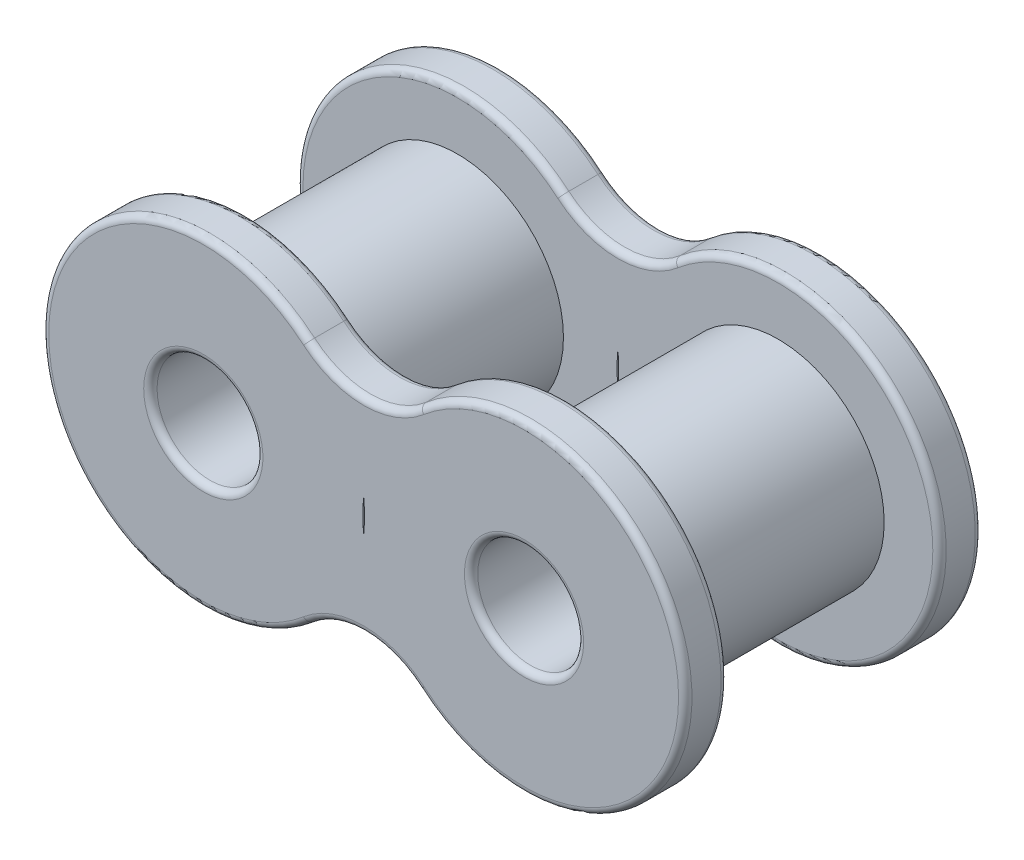
ISO-10303-21;
HEADER;
FILE_DESCRIPTION(('STEP AP214'),'2;1');
FILE_NAME('part.step','',(''),(''),'','','');
FILE_SCHEMA(('AUTOMOTIVE_DESIGN { 1 0 10303 214 1 1 1 1 }'));
ENDSEC;
DATA;
#1=APPLICATION_CONTEXT('core data for automotive mechanical design processes');
#2=APPLICATION_PROTOCOL_DEFINITION('international standard','automotive_design',2000,#1);
#3=PRODUCT_CONTEXT('',#1,'mechanical');
#4=PRODUCT('Part','Part','',(#3));
#5=PRODUCT_RELATED_PRODUCT_CATEGORY('part','',(#4));
#6=PRODUCT_DEFINITION_FORMATION('','',#4);
#7=PRODUCT_DEFINITION_CONTEXT('part definition',#1,'design');
#8=PRODUCT_DEFINITION('design','',#6,#7);
#9=PRODUCT_DEFINITION_SHAPE('','',#8);
#10=(LENGTH_UNIT() NAMED_UNIT(*) SI_UNIT(.MILLI.,.METRE.));
#11=(NAMED_UNIT(*) PLANE_ANGLE_UNIT() SI_UNIT($,.RADIAN.));
#12=(NAMED_UNIT(*) SI_UNIT($,.STERADIAN.) SOLID_ANGLE_UNIT());
#13=UNCERTAINTY_MEASURE_WITH_UNIT(LENGTH_MEASURE(1.E-05),#10,'distance_accuracy_value','');
#14=(GEOMETRIC_REPRESENTATION_CONTEXT(3) GLOBAL_UNCERTAINTY_ASSIGNED_CONTEXT((#13)) GLOBAL_UNIT_ASSIGNED_CONTEXT((#10,
#11,#12)) REPRESENTATION_CONTEXT('',''));
#15=CARTESIAN_POINT('',(0.,0.,0.));
#16=DIRECTION('',(0.,0.,1.));
#17=DIRECTION('',(1.,0.,0.));
#18=AXIS2_PLACEMENT_3D('',#15,#16,#17);
#19=CARTESIAN_POINT('',(3.,3.51510335018759,1.5875));
#20=DIRECTION('',(0.,0.,1.));
#21=DIRECTION('',(1.,0.,0.));
#22=AXIS2_PLACEMENT_3D('',#19,#20,#21);
#23=PLANE('',#22);
#24=CARTESIAN_POINT('',(-6.,0.,1.5875));
#25=DIRECTION('',(0.,0.,1.));
#26=DIRECTION('',(1.,0.,0.));
#27=AXIS2_PLACEMENT_3D('',#24,#25,#26);
#28=CIRCLE('',#27,3.9624);
#29=CARTESIAN_POINT('',(-2.0376,0.,1.5875));
#30=VERTEX_POINT('',#29);
#31=EDGE_CURVE('E288',#30,#30,#28,.T.);
#32=ORIENTED_EDGE('',*,*,#31,.F.);
#33=EDGE_LOOP('',(#32));
#34=FACE_BOUND('',#33,.T.);
#35=CARTESIAN_POINT('',(6.,0.,1.5875));
#36=DIRECTION('',(0.,0.,1.));
#37=DIRECTION('',(1.,0.,0.));
#38=AXIS2_PLACEMENT_3D('',#35,#36,#37);
#39=CIRCLE('',#38,3.9624);
#40=CARTESIAN_POINT('',(9.9624,0.,1.5875));
#41=VERTEX_POINT('',#40);
#42=EDGE_CURVE('E215',#41,#41,#39,.T.);
#43=ORIENTED_EDGE('',*,*,#42,.F.);
#44=EDGE_LOOP('',(#43));
#45=FACE_BOUND('',#44,.T.);
#46=CARTESIAN_POINT('',(6.,0.,1.5875));
#47=DIRECTION('',(0.,0.,1.));
#48=DIRECTION('',(1.,0.,0.));
#49=AXIS2_PLACEMENT_3D('',#46,#47,#48);
#50=CIRCLE('',#49,5.7825);
#51=CARTESIAN_POINT('',(2.24614552339735,-4.39839548227421,1.5875));
#52=VERTEX_POINT('',#51);
#53=CARTESIAN_POINT('',(2.24614552339735,4.39839548227421,1.5875));
#54=VERTEX_POINT('',#53);
#55=EDGE_CURVE('E279',#52,#54,#50,.T.);
#56=ORIENTED_EDGE('',*,*,#55,.T.);
#57=CARTESIAN_POINT('',(0.,7.03020670037517,1.5875));
#58=DIRECTION('',(0.,0.,1.));
#59=DIRECTION('',(1.,0.,0.));
#60=AXIS2_PLACEMENT_3D('',#57,#58,#59);
#61=CIRCLE('',#60,3.46);
#62=CARTESIAN_POINT('',(-2.24614552339735,4.39839548227421,1.5875));
#63=VERTEX_POINT('',#62);
#64=EDGE_CURVE('E281',#54,#63,#61,.F.);
#65=ORIENTED_EDGE('',*,*,#64,.T.);
#66=CARTESIAN_POINT('',(-6.,0.,1.5875));
#67=DIRECTION('',(0.,0.,1.));
#68=DIRECTION('',(1.,0.,0.));
#69=AXIS2_PLACEMENT_3D('',#66,#67,#68);
#70=CIRCLE('',#69,5.7825);
#71=CARTESIAN_POINT('',(-2.24614552339735,-4.39839548227422,1.5875));
#72=VERTEX_POINT('',#71);
#73=EDGE_CURVE('E275',#63,#72,#70,.T.);
#74=ORIENTED_EDGE('',*,*,#73,.T.);
#75=CARTESIAN_POINT('',(0.,-7.03020670037517,1.5875));
#76=DIRECTION('',(0.,0.,1.));
#77=DIRECTION('',(1.,0.,0.));
#78=AXIS2_PLACEMENT_3D('',#75,#76,#77);
#79=CIRCLE('',#78,3.46);
#80=EDGE_CURVE('E277',#72,#52,#79,.F.);
#81=ORIENTED_EDGE('',*,*,#80,.T.);
#82=EDGE_LOOP('',(#56,#65,#74,#81));
#83=FACE_BOUND('',#82,.T.);
#84=CARTESIAN_POINT('',(-6.,0.,1.5875));
#85=DIRECTION('',(0.,0.,1.));
#86=DIRECTION('',(1.,0.,0.));
#87=AXIS2_PLACEMENT_3D('',#84,#85,#86);
#88=CIRCLE('',#87,6.0325);
#89=CARTESIAN_POINT('',(0.,-0.625344904832522,1.5875));
#90=VERTEX_POINT('',#89);
#91=CARTESIAN_POINT('',(0.,0.625344904832519,1.5875));
#92=VERTEX_POINT('',#91);
#93=EDGE_CURVE('E225',#90,#92,#88,.T.);
#94=ORIENTED_EDGE('',*,*,#93,.F.);
#95=CARTESIAN_POINT('',(6.,0.,1.5875));
#96=DIRECTION('',(0.,0.,1.));
#97=DIRECTION('',(-1.,0.,0.));
#98=AXIS2_PLACEMENT_3D('',#95,#96,#97);
#99=CIRCLE('',#98,6.0325);
#100=EDGE_CURVE('E222',#92,#90,#99,.T.);
#101=ORIENTED_EDGE('',*,*,#100,.F.);
#102=EDGE_LOOP('',(#94,#101));
#103=FACE_BOUND('',#102,.T.);
#104=ADVANCED_FACE('F35',(#34,#45,#83,#103),#23,.T.);
#105=CARTESIAN_POINT('',(3.,3.51510335018759,0.));
#106=DIRECTION('',(0.,0.,1.));
#107=DIRECTION('',(1.,0.,0.));
#108=AXIS2_PLACEMENT_3D('',#105,#106,#107);
#109=PLANE('',#108);
#110=CARTESIAN_POINT('',(-6.,0.,0.));
#111=DIRECTION('',(0.,0.,1.));
#112=DIRECTION('',(1.,0.,0.));
#113=AXIS2_PLACEMENT_3D('',#110,#111,#112);
#114=CIRCLE('',#113,2.23);
#115=CARTESIAN_POINT('',(-3.77,0.,0.));
#116=VERTEX_POINT('',#115);
#117=EDGE_CURVE('E376',#116,#116,#114,.T.);
#118=ORIENTED_EDGE('',*,*,#117,.T.);
#119=EDGE_LOOP('',(#118));
#120=FACE_BOUND('',#119,.T.);
#121=CARTESIAN_POINT('',(6.,0.,0.));
#122=DIRECTION('',(0.,0.,1.));
#123=DIRECTION('',(1.,0.,0.));
#124=AXIS2_PLACEMENT_3D('',#121,#122,#123);
#125=CIRCLE('',#124,2.23);
#126=CARTESIAN_POINT('',(8.23,0.,0.));
#127=VERTEX_POINT('',#126);
#128=EDGE_CURVE('E373',#127,#127,#125,.T.);
#129=ORIENTED_EDGE('',*,*,#128,.T.);
#130=EDGE_LOOP('',(#129));
#131=FACE_BOUND('',#130,.T.);
#132=CARTESIAN_POINT('',(-6.,0.,0.));
#133=DIRECTION('',(0.,0.,1.));
#134=DIRECTION('',(1.,0.,0.));
#135=AXIS2_PLACEMENT_3D('',#132,#133,#134);
#136=CIRCLE('',#135,5.7825);
#137=CARTESIAN_POINT('',(-2.24614552339735,-4.39839548227422,0.));
#138=VERTEX_POINT('',#137);
#139=CARTESIAN_POINT('',(-2.24614552339735,4.39839548227421,0.));
#140=VERTEX_POINT('',#139);
#141=EDGE_CURVE('E258',#138,#140,#136,.F.);
#142=ORIENTED_EDGE('',*,*,#141,.T.);
#143=CARTESIAN_POINT('',(0.,7.03020670037517,0.));
#144=DIRECTION('',(0.,0.,1.));
#145=DIRECTION('',(1.,0.,0.));
#146=AXIS2_PLACEMENT_3D('',#143,#144,#145);
#147=CIRCLE('',#146,3.46);
#148=CARTESIAN_POINT('',(2.24614552339735,4.39839548227421,0.));
#149=VERTEX_POINT('',#148);
#150=EDGE_CURVE('E264',#140,#149,#147,.T.);
#151=ORIENTED_EDGE('',*,*,#150,.T.);
#152=CARTESIAN_POINT('',(6.,0.,0.));
#153=DIRECTION('',(0.,0.,1.));
#154=DIRECTION('',(1.,0.,0.));
#155=AXIS2_PLACEMENT_3D('',#152,#153,#154);
#156=CIRCLE('',#155,5.7825);
#157=CARTESIAN_POINT('',(2.24614552339735,-4.39839548227421,0.));
#158=VERTEX_POINT('',#157);
#159=EDGE_CURVE('E262',#149,#158,#156,.F.);
#160=ORIENTED_EDGE('',*,*,#159,.T.);
#161=CARTESIAN_POINT('',(0.,-7.03020670037517,0.));
#162=DIRECTION('',(0.,0.,1.));
#163=DIRECTION('',(1.,0.,0.));
#164=AXIS2_PLACEMENT_3D('',#161,#162,#163);
#165=CIRCLE('',#164,3.46);
#166=EDGE_CURVE('E260',#158,#138,#165,.T.);
#167=ORIENTED_EDGE('',*,*,#166,.T.);
#168=EDGE_LOOP('',(#142,#151,#160,#167));
#169=FACE_BOUND('',#168,.T.);
#170=CARTESIAN_POINT('',(6.,0.,0.));
#171=DIRECTION('',(0.,0.,1.));
#172=DIRECTION('',(-1.,0.,0.));
#173=AXIS2_PLACEMENT_3D('',#170,#171,#172);
#174=CIRCLE('',#173,6.0325);
#175=CARTESIAN_POINT('',(0.,0.625344904832519,0.));
#176=VERTEX_POINT('',#175);
#177=CARTESIAN_POINT('',(0.,-0.625344904832522,0.));
#178=VERTEX_POINT('',#177);
#179=EDGE_CURVE('E229',#176,#178,#174,.T.);
#180=ORIENTED_EDGE('',*,*,#179,.T.);
#181=CARTESIAN_POINT('',(-6.,0.,0.));
#182=DIRECTION('',(0.,0.,1.));
#183=DIRECTION('',(1.,0.,0.));
#184=AXIS2_PLACEMENT_3D('',#181,#182,#183);
#185=CIRCLE('',#184,6.0325);
#186=EDGE_CURVE('E226',#178,#176,#185,.T.);
#187=ORIENTED_EDGE('',*,*,#186,.T.);
#188=EDGE_LOOP('',(#180,#187));
#189=FACE_BOUND('',#188,.T.);
#190=ADVANCED_FACE('F390',(#120,#131,#169,#189),#109,.F.);
#191=CARTESIAN_POINT('',(0.,7.03020670037517,1.5875));
#192=DIRECTION('',(0.,0.,-1.));
#193=DIRECTION('',(-1.,0.,0.));
#194=AXIS2_PLACEMENT_3D('',#191,#192,#193);
#195=CYLINDRICAL_SURFACE('',#194,3.21);
#196=DIRECTION('',(0.,0.,-1.));
#197=VECTOR('',#196,1.);
#198=CARTESIAN_POINT('',(2.08385177170679,4.58855525236821,1.5875));
#199=LINE('',#198,#197);
#200=CARTESIAN_POINT('',(2.08385177170679,4.58855525236821,1.3375));
#201=VERTEX_POINT('',#200);
#202=CARTESIAN_POINT('',(2.08385177170679,4.58855525236821,0.25));
#203=VERTEX_POINT('',#202);
#204=EDGE_CURVE('E240',#201,#203,#199,.T.);
#205=ORIENTED_EDGE('',*,*,#204,.T.);
#206=CARTESIAN_POINT('',(0.,7.03020670037517,0.25));
#207=DIRECTION('',(0.,0.,1.));
#208=DIRECTION('',(1.,0.,0.));
#209=AXIS2_PLACEMENT_3D('',#206,#207,#208);
#210=CIRCLE('',#209,3.21);
#211=CARTESIAN_POINT('',(-2.08385177170679,4.58855525236821,0.25));
#212=VERTEX_POINT('',#211);
#213=EDGE_CURVE('E255',#203,#212,#210,.F.);
#214=ORIENTED_EDGE('',*,*,#213,.T.);
#215=DIRECTION('',(0.,0.,-1.));
#216=VECTOR('',#215,1.);
#217=CARTESIAN_POINT('',(-2.08385177170679,4.58855525236821,1.5875));
#218=LINE('',#217,#216);
#219=CARTESIAN_POINT('',(-2.08385177170679,4.58855525236821,1.3375));
#220=VERTEX_POINT('',#219);
#221=EDGE_CURVE('E249',#220,#212,#218,.T.);
#222=ORIENTED_EDGE('',*,*,#221,.F.);
#223=CARTESIAN_POINT('',(0.,7.03020670037517,1.3375));
#224=DIRECTION('',(0.,0.,1.));
#225=DIRECTION('',(1.,0.,0.));
#226=AXIS2_PLACEMENT_3D('',#223,#224,#225);
#227=CIRCLE('',#226,3.21);
#228=EDGE_CURVE('E252',#220,#201,#227,.T.);
#229=ORIENTED_EDGE('',*,*,#228,.T.);
#230=EDGE_LOOP('',(#205,#214,#222,#229));
#231=FACE_BOUND('',#230,.T.);
#232=ADVANCED_FACE('F393',(#231),#195,.F.);
#233=CARTESIAN_POINT('',(-6.,0.,1.5875));
#234=DIRECTION('',(0.,0.,-1.));
#235=DIRECTION('',(-1.,0.,0.));
#236=AXIS2_PLACEMENT_3D('',#233,#234,#235);
#237=CYLINDRICAL_SURFACE('',#236,6.0325);
#238=ORIENTED_EDGE('',*,*,#221,.T.);
#239=CARTESIAN_POINT('',(-6.,0.,0.25));
#240=DIRECTION('',(0.,0.,1.));
#241=DIRECTION('',(1.,0.,0.));
#242=AXIS2_PLACEMENT_3D('',#239,#240,#241);
#243=CIRCLE('',#242,6.0325);
#244=CARTESIAN_POINT('',(-2.08385177170679,-4.58855525236821,0.25));
#245=VERTEX_POINT('',#244);
#246=EDGE_CURVE('E286',#212,#245,#243,.T.);
#247=ORIENTED_EDGE('',*,*,#246,.T.);
#248=DIRECTION('',(0.,0.,-1.));
#249=VECTOR('',#248,1.);
#250=CARTESIAN_POINT('',(-2.08385177170679,-4.58855525236821,1.5875));
#251=LINE('',#250,#249);
#252=CARTESIAN_POINT('',(-2.08385177170679,-4.58855525236821,1.3375));
#253=VERTEX_POINT('',#252);
#254=EDGE_CURVE('E246',#253,#245,#251,.T.);
#255=ORIENTED_EDGE('',*,*,#254,.F.);
#256=CARTESIAN_POINT('',(-6.,0.,1.3375));
#257=DIRECTION('',(0.,0.,1.));
#258=DIRECTION('',(1.,0.,0.));
#259=AXIS2_PLACEMENT_3D('',#256,#257,#258);
#260=CIRCLE('',#259,6.0325);
#261=EDGE_CURVE('E284',#253,#220,#260,.F.);
#262=ORIENTED_EDGE('',*,*,#261,.T.);
#263=EDGE_LOOP('',(#238,#247,#255,#262));
#264=FACE_BOUND('',#263,.T.);
#265=ADVANCED_FACE('F426',(#264),#237,.T.);
#266=CARTESIAN_POINT('',(0.,-7.03020670037517,1.5875));
#267=DIRECTION('',(0.,0.,-1.));
#268=DIRECTION('',(-1.,0.,0.));
#269=AXIS2_PLACEMENT_3D('',#266,#267,#268);
#270=CYLINDRICAL_SURFACE('',#269,3.21);
#271=ORIENTED_EDGE('',*,*,#254,.T.);
#272=CARTESIAN_POINT('',(0.,-7.03020670037517,0.25));
#273=DIRECTION('',(0.,0.,1.));
#274=DIRECTION('',(1.,0.,0.));
#275=AXIS2_PLACEMENT_3D('',#272,#273,#274);
#276=CIRCLE('',#275,3.21);
#277=CARTESIAN_POINT('',(2.08385177170679,-4.58855525236821,0.25));
#278=VERTEX_POINT('',#277);
#279=EDGE_CURVE('E273',#245,#278,#276,.F.);
#280=ORIENTED_EDGE('',*,*,#279,.T.);
#281=DIRECTION('',(0.,0.,-1.));
#282=VECTOR('',#281,1.);
#283=CARTESIAN_POINT('',(2.08385177170679,-4.58855525236821,1.5875));
#284=LINE('',#283,#282);
#285=CARTESIAN_POINT('',(2.08385177170679,-4.58855525236821,1.3375));
#286=VERTEX_POINT('',#285);
#287=EDGE_CURVE('E243',#286,#278,#284,.T.);
#288=ORIENTED_EDGE('',*,*,#287,.F.);
#289=CARTESIAN_POINT('',(0.,-7.03020670037517,1.3375));
#290=DIRECTION('',(0.,0.,1.));
#291=DIRECTION('',(1.,0.,0.));
#292=AXIS2_PLACEMENT_3D('',#289,#290,#291);
#293=CIRCLE('',#292,3.21);
#294=EDGE_CURVE('E271',#286,#253,#293,.T.);
#295=ORIENTED_EDGE('',*,*,#294,.T.);
#296=EDGE_LOOP('',(#271,#280,#288,#295));
#297=FACE_BOUND('',#296,.T.);
#298=ADVANCED_FACE('F422',(#297),#270,.F.);
#299=CARTESIAN_POINT('',(6.,0.,1.5875));
#300=DIRECTION('',(0.,0.,-1.));
#301=DIRECTION('',(-1.,0.,0.));
#302=AXIS2_PLACEMENT_3D('',#299,#300,#301);
#303=CYLINDRICAL_SURFACE('',#302,6.0325);
#304=ORIENTED_EDGE('',*,*,#287,.T.);
#305=CARTESIAN_POINT('',(6.,0.,0.25));
#306=DIRECTION('',(0.,0.,1.));
#307=DIRECTION('',(1.,0.,0.));
#308=AXIS2_PLACEMENT_3D('',#305,#306,#307);
#309=CIRCLE('',#308,6.0325);
#310=EDGE_CURVE('E269',#278,#203,#309,.T.);
#311=ORIENTED_EDGE('',*,*,#310,.T.);
#312=ORIENTED_EDGE('',*,*,#204,.F.);
#313=CARTESIAN_POINT('',(6.,0.,1.3375));
#314=DIRECTION('',(0.,0.,1.));
#315=DIRECTION('',(1.,0.,0.));
#316=AXIS2_PLACEMENT_3D('',#313,#314,#315);
#317=CIRCLE('',#316,6.0325);
#318=EDGE_CURVE('E267',#201,#286,#317,.F.);
#319=ORIENTED_EDGE('',*,*,#318,.T.);
#320=EDGE_LOOP('',(#304,#311,#312,#319));
#321=FACE_BOUND('',#320,.T.);
#322=ADVANCED_FACE('F419',(#321),#303,.T.);
#323=CARTESIAN_POINT('',(6.,0.,1.5875));
#324=DIRECTION('',(0.,0.,-1.));
#325=DIRECTION('',(-1.,0.,0.));
#326=AXIS2_PLACEMENT_3D('',#323,#324,#325);
#327=CYLINDRICAL_SURFACE('',#326,1.98);
#328=CARTESIAN_POINT('',(6.,0.,0.25));
#329=DIRECTION('',(0.,0.,1.));
#330=DIRECTION('',(1.,0.,0.));
#331=AXIS2_PLACEMENT_3D('',#328,#329,#330);
#332=CIRCLE('',#331,1.98);
#333=CARTESIAN_POINT('',(7.98,0.,0.25));
#334=VERTEX_POINT('',#333);
#335=EDGE_CURVE('E12',#334,#334,#332,.F.);
#336=ORIENTED_EDGE('',*,*,#335,.T.);
#337=EDGE_LOOP('',(#336));
#338=FACE_BOUND('',#337,.T.);
#339=CARTESIAN_POINT('',(6.,0.,10.8498));
#340=DIRECTION('',(0.,0.,-1.));
#341=DIRECTION('',(-1.,0.,0.));
#342=AXIS2_PLACEMENT_3D('',#339,#340,#341);
#343=CIRCLE('',#342,1.98);
#344=CARTESIAN_POINT('',(4.02,0.,10.8498));
#345=VERTEX_POINT('',#344);
#346=EDGE_CURVE('E367',#345,#345,#343,.F.);
#347=ORIENTED_EDGE('',*,*,#346,.T.);
#348=EDGE_LOOP('',(#347));
#349=FACE_BOUND('',#348,.T.);
#350=ADVANCED_FACE('F416',(#338,#349),#327,.F.);
#351=CARTESIAN_POINT('',(-6.,0.,1.5875));
#352=DIRECTION('',(0.,0.,-1.));
#353=DIRECTION('',(-1.,0.,0.));
#354=AXIS2_PLACEMENT_3D('',#351,#352,#353);
#355=CYLINDRICAL_SURFACE('',#354,1.98);
#356=CARTESIAN_POINT('',(-6.,0.,0.25));
#357=DIRECTION('',(0.,0.,1.));
#358=DIRECTION('',(1.,0.,0.));
#359=AXIS2_PLACEMENT_3D('',#356,#357,#358);
#360=CIRCLE('',#359,1.98);
#361=CARTESIAN_POINT('',(-4.02,0.,0.25));
#362=VERTEX_POINT('',#361);
#363=EDGE_CURVE('E43',#362,#362,#360,.F.);
#364=ORIENTED_EDGE('',*,*,#363,.T.);
#365=EDGE_LOOP('',(#364));
#366=FACE_BOUND('',#365,.T.);
#367=CARTESIAN_POINT('',(-6.,0.,10.8498));
#368=DIRECTION('',(0.,0.,-1.));
#369=DIRECTION('',(-1.,0.,0.));
#370=AXIS2_PLACEMENT_3D('',#367,#368,#369);
#371=CIRCLE('',#370,1.98);
#372=CARTESIAN_POINT('',(-7.98,0.,10.8498));
#373=VERTEX_POINT('',#372);
#374=EDGE_CURVE('E343',#373,#373,#371,.F.);
#375=ORIENTED_EDGE('',*,*,#374,.T.);
#376=EDGE_LOOP('',(#375));
#377=FACE_BOUND('',#376,.T.);
#378=ADVANCED_FACE('F381',(#366,#377),#355,.F.);
#379=CARTESIAN_POINT('',(6.,0.,1.5875));
#380=DIRECTION('',(0.,0.,-1.));
#381=DIRECTION('',(-1.,0.,0.));
#382=AXIS2_PLACEMENT_3D('',#379,#380,#381);
#383=CYLINDRICAL_SURFACE('',#382,6.0325);
#384=ORIENTED_EDGE('',*,*,#179,.F.);
#385=DIRECTION('',(0.,0.,-1.));
#386=VECTOR('',#385,1.);
#387=CARTESIAN_POINT('',(0.,0.625344904832519,1.5875));
#388=LINE('',#387,#386);
#389=EDGE_CURVE('E228',#92,#176,#388,.T.);
#390=ORIENTED_EDGE('',*,*,#389,.F.);
#391=ORIENTED_EDGE('',*,*,#100,.T.);
#392=DIRECTION('',(0.,0.,-1.));
#393=VECTOR('',#392,1.);
#394=CARTESIAN_POINT('',(0.,-0.625344904832522,1.5875));
#395=LINE('',#394,#393);
#396=EDGE_CURVE('E237',#90,#178,#395,.T.);
#397=ORIENTED_EDGE('',*,*,#396,.T.);
#398=EDGE_LOOP('',(#384,#390,#391,#397));
#399=FACE_BOUND('',#398,.T.);
#400=ADVANCED_FACE('F402',(#399),#383,.F.);
#401=CARTESIAN_POINT('',(-6.,0.,1.5875));
#402=DIRECTION('',(0.,0.,-1.));
#403=DIRECTION('',(-1.,0.,0.));
#404=AXIS2_PLACEMENT_3D('',#401,#402,#403);
#405=CYLINDRICAL_SURFACE('',#404,6.0325);
#406=ORIENTED_EDGE('',*,*,#186,.F.);
#407=ORIENTED_EDGE('',*,*,#396,.F.);
#408=ORIENTED_EDGE('',*,*,#93,.T.);
#409=ORIENTED_EDGE('',*,*,#389,.T.);
#410=EDGE_LOOP('',(#406,#407,#408,#409));
#411=FACE_BOUND('',#410,.T.);
#412=ADVANCED_FACE('F405',(#411),#405,.F.);
#413=CARTESIAN_POINT('',(0.,-7.03020670037517,0.25));
#414=DIRECTION('',(0.,0.,1.));
#415=DIRECTION('',(1.,0.,0.));
#416=AXIS2_PLACEMENT_3D('',#413,#414,#415);
#417=TOROIDAL_SURFACE('',#416,3.46,0.25);
#418=CARTESIAN_POINT('',(-2.24614552339735,-4.39839548227422,0.25));
#419=DIRECTION('',(-0.760639080375998,-0.649175006762241,0.));
#420=DIRECTION('',(0.649175006762241,-0.760639080375998,0.));
#421=AXIS2_PLACEMENT_3D('',#418,#419,#420);
#422=CIRCLE('',#421,0.25);
#423=EDGE_CURVE('E294',#138,#245,#422,.T.);
#424=ORIENTED_EDGE('',*,*,#423,.F.);
#425=ORIENTED_EDGE('',*,*,#166,.F.);
#426=CARTESIAN_POINT('',(2.24614552339735,-4.39839548227422,0.25));
#427=DIRECTION('',(0.760639080375998,-0.649175006762241,0.));
#428=DIRECTION('',(0.649175006762241,0.760639080375998,0.));
#429=AXIS2_PLACEMENT_3D('',#426,#427,#428);
#430=CIRCLE('',#429,0.25);
#431=EDGE_CURVE('E232',#278,#158,#430,.T.);
#432=ORIENTED_EDGE('',*,*,#431,.F.);
#433=ORIENTED_EDGE('',*,*,#279,.F.);
#434=EDGE_LOOP('',(#424,#425,#432,#433));
#435=FACE_BOUND('',#434,.T.);
#436=ADVANCED_FACE('F446',(#435),#417,.T.);
#437=CARTESIAN_POINT('',(6.,0.,0.25));
#438=DIRECTION('',(0.,0.,1.));
#439=DIRECTION('',(1.,0.,0.));
#440=AXIS2_PLACEMENT_3D('',#437,#438,#439);
#441=TOROIDAL_SURFACE('',#440,5.7825,0.25);
#442=ORIENTED_EDGE('',*,*,#431,.T.);
#443=ORIENTED_EDGE('',*,*,#159,.F.);
#444=CARTESIAN_POINT('',(2.24614552339735,4.39839548227421,0.25));
#445=DIRECTION('',(-0.760639080375998,-0.649175006762241,0.));
#446=DIRECTION('',(0.649175006762241,-0.760639080375998,0.));
#447=AXIS2_PLACEMENT_3D('',#444,#445,#446);
#448=CIRCLE('',#447,0.25);
#449=EDGE_CURVE('E291',#203,#149,#448,.T.);
#450=ORIENTED_EDGE('',*,*,#449,.F.);
#451=ORIENTED_EDGE('',*,*,#310,.F.);
#452=EDGE_LOOP('',(#442,#443,#450,#451));
#453=FACE_BOUND('',#452,.T.);
#454=ADVANCED_FACE('F442',(#453),#441,.T.);
#455=CARTESIAN_POINT('',(-6.,0.,0.25));
#456=DIRECTION('',(0.,0.,1.));
#457=DIRECTION('',(1.,0.,0.));
#458=AXIS2_PLACEMENT_3D('',#455,#456,#457);
#459=TOROIDAL_SURFACE('',#458,5.7825,0.25);
#460=ORIENTED_EDGE('',*,*,#423,.T.);
#461=ORIENTED_EDGE('',*,*,#246,.F.);
#462=CARTESIAN_POINT('',(-2.24614552339735,4.39839548227421,0.25));
#463=DIRECTION('',(0.760639080375998,-0.649175006762241,0.));
#464=DIRECTION('',(0.649175006762241,0.760639080375998,0.));
#465=AXIS2_PLACEMENT_3D('',#462,#463,#464);
#466=CIRCLE('',#465,0.25);
#467=EDGE_CURVE('E289',#140,#212,#466,.T.);
#468=ORIENTED_EDGE('',*,*,#467,.F.);
#469=ORIENTED_EDGE('',*,*,#141,.F.);
#470=EDGE_LOOP('',(#460,#461,#468,#469));
#471=FACE_BOUND('',#470,.T.);
#472=ADVANCED_FACE('F438',(#471),#459,.T.);
#473=CARTESIAN_POINT('',(0.,7.03020670037517,0.25));
#474=DIRECTION('',(0.,0.,1.));
#475=DIRECTION('',(1.,0.,0.));
#476=AXIS2_PLACEMENT_3D('',#473,#474,#475);
#477=TOROIDAL_SURFACE('',#476,3.46,0.25);
#478=ORIENTED_EDGE('',*,*,#449,.T.);
#479=ORIENTED_EDGE('',*,*,#150,.F.);
#480=ORIENTED_EDGE('',*,*,#467,.T.);
#481=ORIENTED_EDGE('',*,*,#213,.F.);
#482=EDGE_LOOP('',(#478,#479,#480,#481));
#483=FACE_BOUND('',#482,.T.);
#484=ADVANCED_FACE('F434',(#483),#477,.T.);
#485=CARTESIAN_POINT('',(0.,-7.03020670037517,1.3375));
#486=DIRECTION('',(0.,0.,1.));
#487=DIRECTION('',(1.,0.,0.));
#488=AXIS2_PLACEMENT_3D('',#485,#486,#487);
#489=TOROIDAL_SURFACE('',#488,3.46,0.25);
#490=CARTESIAN_POINT('',(-2.24614552339735,-4.39839548227422,1.3375));
#491=DIRECTION('',(-0.760639080375998,-0.649175006762241,0.));
#492=DIRECTION('',(0.649175006762241,-0.760639080375998,0.));
#493=AXIS2_PLACEMENT_3D('',#490,#491,#492);
#494=CIRCLE('',#493,0.25);
#495=EDGE_CURVE('E302',#253,#72,#494,.T.);
#496=ORIENTED_EDGE('',*,*,#495,.F.);
#497=ORIENTED_EDGE('',*,*,#294,.F.);
#498=CARTESIAN_POINT('',(2.24614552339735,-4.39839548227421,1.3375));
#499=DIRECTION('',(0.760639080375999,-0.64917500676224,0.));
#500=DIRECTION('',(0.64917500676224,0.760639080375999,0.));
#501=AXIS2_PLACEMENT_3D('',#498,#499,#500);
#502=CIRCLE('',#501,0.25);
#503=EDGE_CURVE('E292',#52,#286,#502,.T.);
#504=ORIENTED_EDGE('',*,*,#503,.F.);
#505=ORIENTED_EDGE('',*,*,#80,.F.);
#506=EDGE_LOOP('',(#496,#497,#504,#505));
#507=FACE_BOUND('',#506,.T.);
#508=ADVANCED_FACE('F437',(#507),#489,.T.);
#509=CARTESIAN_POINT('',(6.,0.,1.3375));
#510=DIRECTION('',(0.,0.,1.));
#511=DIRECTION('',(1.,0.,0.));
#512=AXIS2_PLACEMENT_3D('',#509,#510,#511);
#513=TOROIDAL_SURFACE('',#512,5.7825,0.25);
#514=ORIENTED_EDGE('',*,*,#503,.T.);
#515=ORIENTED_EDGE('',*,*,#318,.F.);
#516=CARTESIAN_POINT('',(2.24614552339735,4.39839548227421,1.3375));
#517=DIRECTION('',(-0.760639080375998,-0.649175006762241,0.));
#518=DIRECTION('',(0.649175006762241,-0.760639080375998,0.));
#519=AXIS2_PLACEMENT_3D('',#516,#517,#518);
#520=CIRCLE('',#519,0.25);
#521=EDGE_CURVE('E300',#54,#201,#520,.T.);
#522=ORIENTED_EDGE('',*,*,#521,.F.);
#523=ORIENTED_EDGE('',*,*,#55,.F.);
#524=EDGE_LOOP('',(#514,#515,#522,#523));
#525=FACE_BOUND('',#524,.T.);
#526=ADVANCED_FACE('F459',(#525),#513,.T.);
#527=CARTESIAN_POINT('',(-6.,0.,1.3375));
#528=DIRECTION('',(0.,0.,1.));
#529=DIRECTION('',(1.,0.,0.));
#530=AXIS2_PLACEMENT_3D('',#527,#528,#529);
#531=TOROIDAL_SURFACE('',#530,5.7825,0.25);
#532=ORIENTED_EDGE('',*,*,#495,.T.);
#533=ORIENTED_EDGE('',*,*,#73,.F.);
#534=CARTESIAN_POINT('',(-2.24614552339735,4.39839548227421,1.3375));
#535=DIRECTION('',(0.760639080375998,-0.649175006762241,0.));
#536=DIRECTION('',(0.649175006762241,0.760639080375998,0.));
#537=AXIS2_PLACEMENT_3D('',#534,#535,#536);
#538=CIRCLE('',#537,0.25);
#539=EDGE_CURVE('E219',#220,#63,#538,.T.);
#540=ORIENTED_EDGE('',*,*,#539,.F.);
#541=ORIENTED_EDGE('',*,*,#261,.F.);
#542=EDGE_LOOP('',(#532,#533,#540,#541));
#543=FACE_BOUND('',#542,.T.);
#544=ADVANCED_FACE('F455',(#543),#531,.T.);
#545=CARTESIAN_POINT('',(0.,7.03020670037517,1.3375));
#546=DIRECTION('',(0.,0.,1.));
#547=DIRECTION('',(1.,0.,0.));
#548=AXIS2_PLACEMENT_3D('',#545,#546,#547);
#549=TOROIDAL_SURFACE('',#548,3.46,0.25);
#550=ORIENTED_EDGE('',*,*,#521,.T.);
#551=ORIENTED_EDGE('',*,*,#228,.F.);
#552=ORIENTED_EDGE('',*,*,#539,.T.);
#553=ORIENTED_EDGE('',*,*,#64,.F.);
#554=EDGE_LOOP('',(#550,#551,#552,#553));
#555=FACE_BOUND('',#554,.T.);
#556=ADVANCED_FACE('F451',(#555),#549,.T.);
#557=CARTESIAN_POINT('',(6.,0.,9.5123));
#558=DIRECTION('',(0.,0.,-1.));
#559=DIRECTION('',(-1.,0.,0.));
#560=AXIS2_PLACEMENT_3D('',#557,#558,#559);
#561=CYLINDRICAL_SURFACE('',#560,3.9624);
#562=CARTESIAN_POINT('',(6.,0.,9.5123));
#563=DIRECTION('',(0.,0.,1.));
#564=DIRECTION('',(1.,0.,0.));
#565=AXIS2_PLACEMENT_3D('',#562,#563,#564);
#566=CIRCLE('',#565,3.9624);
#567=CARTESIAN_POINT('',(9.9624,0.,9.5123));
#568=VERTEX_POINT('',#567);
#569=EDGE_CURVE('E216',#568,#568,#566,.T.);
#570=ORIENTED_EDGE('',*,*,#569,.F.);
#571=EDGE_LOOP('',(#570));
#572=FACE_BOUND('',#571,.T.);
#573=ORIENTED_EDGE('',*,*,#42,.T.);
#574=EDGE_LOOP('',(#573));
#575=FACE_BOUND('',#574,.T.);
#576=ADVANCED_FACE('F454',(#572,#575),#561,.T.);
#577=CARTESIAN_POINT('',(-6.,0.,9.5123));
#578=DIRECTION('',(0.,0.,-1.));
#579=DIRECTION('',(-1.,0.,0.));
#580=AXIS2_PLACEMENT_3D('',#577,#578,#579);
#581=CYLINDRICAL_SURFACE('',#580,3.9624);
#582=CARTESIAN_POINT('',(-6.,0.,9.5123));
#583=DIRECTION('',(0.,0.,-1.));
#584=DIRECTION('',(-1.,0.,0.));
#585=AXIS2_PLACEMENT_3D('',#582,#583,#584);
#586=CIRCLE('',#585,3.9624);
#587=CARTESIAN_POINT('',(-9.9624,0.,9.5123));
#588=VERTEX_POINT('',#587);
#589=EDGE_CURVE('E212',#588,#588,#586,.T.);
#590=ORIENTED_EDGE('',*,*,#589,.T.);
#591=EDGE_LOOP('',(#590));
#592=FACE_BOUND('',#591,.T.);
#593=ORIENTED_EDGE('',*,*,#31,.T.);
#594=EDGE_LOOP('',(#593));
#595=FACE_BOUND('',#594,.T.);
#596=ADVANCED_FACE('F679',(#592,#595),#581,.T.);
#597=CARTESIAN_POINT('',(3.,3.51510335018759,9.5123));
#598=DIRECTION('',(0.,0.,-1.));
#599=DIRECTION('',(1.,0.,0.));
#600=AXIS2_PLACEMENT_3D('',#597,#598,#599);
#601=PLANE('',#600);
#602=CARTESIAN_POINT('',(-6.,0.,9.5123));
#603=DIRECTION('',(0.,0.,-1.));
#604=DIRECTION('',(-1.,0.,0.));
#605=AXIS2_PLACEMENT_3D('',#602,#603,#604);
#606=CIRCLE('',#605,5.7825);
#607=CARTESIAN_POINT('',(-2.24614552339735,-4.39839548227422,9.5123));
#608=VERTEX_POINT('',#607);
#609=CARTESIAN_POINT('',(-2.24614552339735,4.39839548227421,9.5123));
#610=VERTEX_POINT('',#609);
#611=EDGE_CURVE('E332',#608,#610,#606,.T.);
#612=ORIENTED_EDGE('',*,*,#611,.T.);
#613=CARTESIAN_POINT('',(0.,7.03020670037517,9.5123));
#614=DIRECTION('',(0.,0.,-1.));
#615=DIRECTION('',(-1.,0.,0.));
#616=AXIS2_PLACEMENT_3D('',#613,#614,#615);
#617=CIRCLE('',#616,3.46);
#618=CARTESIAN_POINT('',(2.24614552339735,4.39839548227421,9.5123));
#619=VERTEX_POINT('',#618);
#620=EDGE_CURVE('E337',#610,#619,#617,.F.);
#621=ORIENTED_EDGE('',*,*,#620,.T.);
#622=CARTESIAN_POINT('',(6.,0.,9.5123));
#623=DIRECTION('',(0.,0.,-1.));
#624=DIRECTION('',(-1.,0.,0.));
#625=AXIS2_PLACEMENT_3D('',#622,#623,#624);
#626=CIRCLE('',#625,5.7825);
#627=CARTESIAN_POINT('',(2.24614552339735,-4.39839548227421,9.5123));
#628=VERTEX_POINT('',#627);
#629=EDGE_CURVE('E57',#619,#628,#626,.T.);
#630=ORIENTED_EDGE('',*,*,#629,.T.);
#631=CARTESIAN_POINT('',(0.,-7.03020670037517,9.5123));
#632=DIRECTION('',(0.,0.,-1.));
#633=DIRECTION('',(-1.,0.,0.));
#634=AXIS2_PLACEMENT_3D('',#631,#632,#633);
#635=CIRCLE('',#634,3.46);
#636=EDGE_CURVE('E334',#628,#608,#635,.F.);
#637=ORIENTED_EDGE('',*,*,#636,.T.);
#638=EDGE_LOOP('',(#612,#621,#630,#637));
#639=FACE_BOUND('',#638,.T.);
#640=CARTESIAN_POINT('',(6.,0.,9.5123));
#641=DIRECTION('',(0.,0.,1.));
#642=DIRECTION('',(-1.,0.,0.));
#643=AXIS2_PLACEMENT_3D('',#640,#641,#642);
#644=CIRCLE('',#643,6.0325);
#645=CARTESIAN_POINT('',(0.,0.625344904832519,9.5123));
#646=VERTEX_POINT('',#645);
#647=CARTESIAN_POINT('',(0.,-0.625344904832522,9.5123));
#648=VERTEX_POINT('',#647);
#649=EDGE_CURVE('E177',#646,#648,#644,.T.);
#650=ORIENTED_EDGE('',*,*,#649,.T.);
#651=CARTESIAN_POINT('',(-6.,0.,9.5123));
#652=DIRECTION('',(0.,0.,1.));
#653=DIRECTION('',(1.,0.,0.));
#654=AXIS2_PLACEMENT_3D('',#651,#652,#653);
#655=CIRCLE('',#654,6.0325);
#656=EDGE_CURVE('E185',#648,#646,#655,.T.);
#657=ORIENTED_EDGE('',*,*,#656,.T.);
#658=EDGE_LOOP('',(#650,#657));
#659=FACE_BOUND('',#658,.T.);
#660=ORIENTED_EDGE('',*,*,#589,.F.);
#661=EDGE_LOOP('',(#660));
#662=FACE_BOUND('',#661,.T.);
#663=ORIENTED_EDGE('',*,*,#569,.T.);
#664=EDGE_LOOP('',(#663));
#665=FACE_BOUND('',#664,.T.);
#666=ADVANCED_FACE('F191',(#639,#659,#662,#665),#601,.T.);
#667=CARTESIAN_POINT('',(0.,7.03020670037517,9.5123));
#668=DIRECTION('',(0.,0.,1.));
#669=DIRECTION('',(1.,0.,0.));
#670=AXIS2_PLACEMENT_3D('',#667,#668,#669);
#671=CYLINDRICAL_SURFACE('',#670,3.21);
#672=DIRECTION('',(0.,0.,1.));
#673=VECTOR('',#672,1.);
#674=CARTESIAN_POINT('',(-2.08385177170679,4.58855525236821,9.5123));
#675=LINE('',#674,#673);
#676=CARTESIAN_POINT('',(-2.08385177170679,4.58855525236821,9.7623));
#677=VERTEX_POINT('',#676);
#678=CARTESIAN_POINT('',(-2.08385177170679,4.58855525236821,10.8498));
#679=VERTEX_POINT('',#678);
#680=EDGE_CURVE('E200',#677,#679,#675,.T.);
#681=ORIENTED_EDGE('',*,*,#680,.T.);
#682=CARTESIAN_POINT('',(0.,7.03020670037517,10.8498));
#683=DIRECTION('',(0.,0.,-1.));
#684=DIRECTION('',(-1.,0.,0.));
#685=AXIS2_PLACEMENT_3D('',#682,#683,#684);
#686=CIRCLE('',#685,3.21);
#687=CARTESIAN_POINT('',(2.08385177170679,4.58855525236821,10.8498));
#688=VERTEX_POINT('',#687);
#689=EDGE_CURVE('E321',#679,#688,#686,.F.);
#690=ORIENTED_EDGE('',*,*,#689,.T.);
#691=DIRECTION('',(0.,0.,1.));
#692=VECTOR('',#691,1.);
#693=CARTESIAN_POINT('',(2.08385177170679,4.58855525236821,9.5123));
#694=LINE('',#693,#692);
#695=CARTESIAN_POINT('',(2.08385177170679,4.58855525236821,9.7623));
#696=VERTEX_POINT('',#695);
#697=EDGE_CURVE('E209',#696,#688,#694,.T.);
#698=ORIENTED_EDGE('',*,*,#697,.F.);
#699=CARTESIAN_POINT('',(0.,7.03020670037517,9.7623));
#700=DIRECTION('',(0.,0.,-1.));
#701=DIRECTION('',(-1.,0.,0.));
#702=AXIS2_PLACEMENT_3D('',#699,#700,#701);
#703=CIRCLE('',#702,3.21);
#704=EDGE_CURVE('E318',#696,#677,#703,.T.);
#705=ORIENTED_EDGE('',*,*,#704,.T.);
#706=EDGE_LOOP('',(#681,#690,#698,#705));
#707=FACE_BOUND('',#706,.T.);
#708=ADVANCED_FACE('F661',(#707),#671,.F.);
#709=CARTESIAN_POINT('',(6.,0.,9.5123));
#710=DIRECTION('',(0.,0.,1.));
#711=DIRECTION('',(1.,0.,0.));
#712=AXIS2_PLACEMENT_3D('',#709,#710,#711);
#713=CYLINDRICAL_SURFACE('',#712,6.0325);
#714=ORIENTED_EDGE('',*,*,#697,.T.);
#715=CARTESIAN_POINT('',(6.,0.,10.8498));
#716=DIRECTION('',(0.,0.,-1.));
#717=DIRECTION('',(-1.,0.,0.));
#718=AXIS2_PLACEMENT_3D('',#715,#716,#717);
#719=CIRCLE('',#718,6.0325);
#720=CARTESIAN_POINT('',(2.08385177170679,-4.58855525236821,10.8498));
#721=VERTEX_POINT('',#720);
#722=EDGE_CURVE('E326',#688,#721,#719,.T.);
#723=ORIENTED_EDGE('',*,*,#722,.T.);
#724=DIRECTION('',(0.,0.,1.));
#725=VECTOR('',#724,1.);
#726=CARTESIAN_POINT('',(2.08385177170679,-4.58855525236821,9.5123));
#727=LINE('',#726,#725);
#728=CARTESIAN_POINT('',(2.08385177170679,-4.58855525236821,9.7623));
#729=VERTEX_POINT('',#728);
#730=EDGE_CURVE('E206',#729,#721,#727,.T.);
#731=ORIENTED_EDGE('',*,*,#730,.F.);
#732=CARTESIAN_POINT('',(6.,0.,9.7623));
#733=DIRECTION('',(0.,0.,-1.));
#734=DIRECTION('',(-1.,0.,0.));
#735=AXIS2_PLACEMENT_3D('',#732,#733,#734);
#736=CIRCLE('',#735,6.0325);
#737=EDGE_CURVE('E324',#729,#696,#736,.F.);
#738=ORIENTED_EDGE('',*,*,#737,.T.);
#739=EDGE_LOOP('',(#714,#723,#731,#738));
#740=FACE_BOUND('',#739,.T.);
#741=ADVANCED_FACE('F651',(#740),#713,.T.);
#742=CARTESIAN_POINT('',(0.,-7.03020670037517,9.5123));
#743=DIRECTION('',(0.,0.,1.));
#744=DIRECTION('',(1.,0.,0.));
#745=AXIS2_PLACEMENT_3D('',#742,#743,#744);
#746=CYLINDRICAL_SURFACE('',#745,3.21);
#747=ORIENTED_EDGE('',*,*,#730,.T.);
#748=CARTESIAN_POINT('',(0.,-7.03020670037517,10.8498));
#749=DIRECTION('',(0.,0.,-1.));
#750=DIRECTION('',(-1.,0.,0.));
#751=AXIS2_PLACEMENT_3D('',#748,#749,#750);
#752=CIRCLE('',#751,3.21);
#753=CARTESIAN_POINT('',(-2.08385177170679,-4.58855525236821,10.8498));
#754=VERTEX_POINT('',#753);
#755=EDGE_CURVE('E330',#721,#754,#752,.F.);
#756=ORIENTED_EDGE('',*,*,#755,.T.);
#757=DIRECTION('',(0.,0.,1.));
#758=VECTOR('',#757,1.);
#759=CARTESIAN_POINT('',(-2.08385177170679,-4.58855525236821,9.5123));
#760=LINE('',#759,#758);
#761=CARTESIAN_POINT('',(-2.08385177170679,-4.58855525236821,9.7623));
#762=VERTEX_POINT('',#761);
#763=EDGE_CURVE('E203',#762,#754,#760,.T.);
#764=ORIENTED_EDGE('',*,*,#763,.F.);
#765=CARTESIAN_POINT('',(0.,-7.03020670037517,9.7623));
#766=DIRECTION('',(0.,0.,-1.));
#767=DIRECTION('',(-1.,0.,0.));
#768=AXIS2_PLACEMENT_3D('',#765,#766,#767);
#769=CIRCLE('',#768,3.21);
#770=EDGE_CURVE('E328',#762,#729,#769,.T.);
#771=ORIENTED_EDGE('',*,*,#770,.T.);
#772=EDGE_LOOP('',(#747,#756,#764,#771));
#773=FACE_BOUND('',#772,.T.);
#774=ADVANCED_FACE('F641',(#773),#746,.F.);
#775=CARTESIAN_POINT('',(-6.,0.,9.5123));
#776=DIRECTION('',(0.,0.,1.));
#777=DIRECTION('',(1.,0.,0.));
#778=AXIS2_PLACEMENT_3D('',#775,#776,#777);
#779=CYLINDRICAL_SURFACE('',#778,6.0325);
#780=ORIENTED_EDGE('',*,*,#763,.T.);
#781=CARTESIAN_POINT('',(-6.,0.,10.8498));
#782=DIRECTION('',(0.,0.,-1.));
#783=DIRECTION('',(-1.,0.,0.));
#784=AXIS2_PLACEMENT_3D('',#781,#782,#783);
#785=CIRCLE('',#784,6.0325);
#786=EDGE_CURVE('E341',#754,#679,#785,.T.);
#787=ORIENTED_EDGE('',*,*,#786,.T.);
#788=ORIENTED_EDGE('',*,*,#680,.F.);
#789=CARTESIAN_POINT('',(-6.,0.,9.7623));
#790=DIRECTION('',(0.,0.,-1.));
#791=DIRECTION('',(-1.,0.,0.));
#792=AXIS2_PLACEMENT_3D('',#789,#790,#791);
#793=CIRCLE('',#792,6.0325);
#794=EDGE_CURVE('E339',#677,#762,#793,.F.);
#795=ORIENTED_EDGE('',*,*,#794,.T.);
#796=EDGE_LOOP('',(#780,#787,#788,#795));
#797=FACE_BOUND('',#796,.T.);
#798=ADVANCED_FACE('F562',(#797),#779,.T.);
#799=CARTESIAN_POINT('',(3.,3.51510335018759,11.0998));
#800=DIRECTION('',(0.,0.,-1.));
#801=DIRECTION('',(1.,0.,0.));
#802=AXIS2_PLACEMENT_3D('',#799,#800,#801);
#803=PLANE('',#802);
#804=CARTESIAN_POINT('',(6.,0.,11.0998));
#805=DIRECTION('',(0.,0.,-1.));
#806=DIRECTION('',(-1.,0.,0.));
#807=AXIS2_PLACEMENT_3D('',#804,#805,#806);
#808=CIRCLE('',#807,2.23);
#809=CARTESIAN_POINT('',(3.77,0.,11.0998));
#810=VERTEX_POINT('',#809);
#811=EDGE_CURVE('E370',#810,#810,#808,.T.);
#812=ORIENTED_EDGE('',*,*,#811,.T.);
#813=EDGE_LOOP('',(#812));
#814=FACE_BOUND('',#813,.T.);
#815=CARTESIAN_POINT('',(-6.,0.,11.0998));
#816=DIRECTION('',(0.,0.,-1.));
#817=DIRECTION('',(-1.,0.,0.));
#818=AXIS2_PLACEMENT_3D('',#815,#816,#817);
#819=CIRCLE('',#818,2.23);
#820=CARTESIAN_POINT('',(-8.23,0.,11.0998));
#821=VERTEX_POINT('',#820);
#822=EDGE_CURVE('E364',#821,#821,#819,.T.);
#823=ORIENTED_EDGE('',*,*,#822,.T.);
#824=EDGE_LOOP('',(#823));
#825=FACE_BOUND('',#824,.T.);
#826=CARTESIAN_POINT('',(6.,0.,11.0998));
#827=DIRECTION('',(0.,0.,-1.));
#828=DIRECTION('',(-1.,0.,0.));
#829=AXIS2_PLACEMENT_3D('',#826,#827,#828);
#830=CIRCLE('',#829,5.7825);
#831=CARTESIAN_POINT('',(2.24614552339735,-4.39839548227421,11.0998));
#832=VERTEX_POINT('',#831);
#833=CARTESIAN_POINT('',(2.24614552339735,4.39839548227421,11.0998));
#834=VERTEX_POINT('',#833);
#835=EDGE_CURVE('E313',#832,#834,#830,.F.);
#836=ORIENTED_EDGE('',*,*,#835,.T.);
#837=CARTESIAN_POINT('',(0.,7.03020670037517,11.0998));
#838=DIRECTION('',(0.,0.,-1.));
#839=DIRECTION('',(-1.,0.,0.));
#840=AXIS2_PLACEMENT_3D('',#837,#838,#839);
#841=CIRCLE('',#840,3.46);
#842=CARTESIAN_POINT('',(-2.24614552339735,4.39839548227421,11.0998));
#843=VERTEX_POINT('',#842);
#844=EDGE_CURVE('E315',#834,#843,#841,.T.);
#845=ORIENTED_EDGE('',*,*,#844,.T.);
#846=CARTESIAN_POINT('',(-6.,0.,11.0998));
#847=DIRECTION('',(0.,0.,-1.));
#848=DIRECTION('',(-1.,0.,0.));
#849=AXIS2_PLACEMENT_3D('',#846,#847,#848);
#850=CIRCLE('',#849,5.7825);
#851=CARTESIAN_POINT('',(-2.24614552339735,-4.39839548227422,11.0998));
#852=VERTEX_POINT('',#851);
#853=EDGE_CURVE('E309',#843,#852,#850,.F.);
#854=ORIENTED_EDGE('',*,*,#853,.T.);
#855=CARTESIAN_POINT('',(0.,-7.03020670037517,11.0998));
#856=DIRECTION('',(0.,0.,-1.));
#857=DIRECTION('',(-1.,0.,0.));
#858=AXIS2_PLACEMENT_3D('',#855,#856,#857);
#859=CIRCLE('',#858,3.46);
#860=EDGE_CURVE('E311',#852,#832,#859,.T.);
#861=ORIENTED_EDGE('',*,*,#860,.T.);
#862=EDGE_LOOP('',(#836,#845,#854,#861));
#863=FACE_BOUND('',#862,.T.);
#864=CARTESIAN_POINT('',(-6.,0.,11.0998));
#865=DIRECTION('',(0.,0.,1.));
#866=DIRECTION('',(1.,0.,0.));
#867=AXIS2_PLACEMENT_3D('',#864,#865,#866);
#868=CIRCLE('',#867,6.0325);
#869=CARTESIAN_POINT('',(0.,-0.625344904832522,11.0998));
#870=VERTEX_POINT('',#869);
#871=CARTESIAN_POINT('',(0.,0.625344904832519,11.0998));
#872=VERTEX_POINT('',#871);
#873=EDGE_CURVE('E193',#870,#872,#868,.T.);
#874=ORIENTED_EDGE('',*,*,#873,.F.);
#875=CARTESIAN_POINT('',(6.,0.,11.0998));
#876=DIRECTION('',(0.,0.,1.));
#877=DIRECTION('',(-1.,0.,0.));
#878=AXIS2_PLACEMENT_3D('',#875,#876,#877);
#879=CIRCLE('',#878,6.0325);
#880=EDGE_CURVE('E180',#872,#870,#879,.T.);
#881=ORIENTED_EDGE('',*,*,#880,.F.);
#882=EDGE_LOOP('',(#874,#881));
#883=FACE_BOUND('',#882,.T.);
#884=ADVANCED_FACE('F557',(#814,#825,#863,#883),#803,.F.);
#885=CARTESIAN_POINT('',(6.,0.,9.5123));
#886=DIRECTION('',(0.,0.,1.));
#887=DIRECTION('',(1.,0.,0.));
#888=AXIS2_PLACEMENT_3D('',#885,#886,#887);
#889=CYLINDRICAL_SURFACE('',#888,6.0325);
#890=ORIENTED_EDGE('',*,*,#880,.T.);
#891=DIRECTION('',(0.,0.,1.));
#892=VECTOR('',#891,1.);
#893=CARTESIAN_POINT('',(0.,-0.625344904832522,9.5123));
#894=LINE('',#893,#892);
#895=EDGE_CURVE('E173',#648,#870,#894,.T.);
#896=ORIENTED_EDGE('',*,*,#895,.F.);
#897=ORIENTED_EDGE('',*,*,#649,.F.);
#898=DIRECTION('',(0.,0.,1.));
#899=VECTOR('',#898,1.);
#900=CARTESIAN_POINT('',(0.,0.625344904832519,9.5123));
#901=LINE('',#900,#899);
#902=EDGE_CURVE('E184',#646,#872,#901,.T.);
#903=ORIENTED_EDGE('',*,*,#902,.T.);
#904=EDGE_LOOP('',(#890,#896,#897,#903));
#905=FACE_BOUND('',#904,.T.);
#906=ADVANCED_FACE('F175',(#905),#889,.F.);
#907=CARTESIAN_POINT('',(-6.,0.,9.5123));
#908=DIRECTION('',(0.,0.,1.));
#909=DIRECTION('',(1.,0.,0.));
#910=AXIS2_PLACEMENT_3D('',#907,#908,#909);
#911=CYLINDRICAL_SURFACE('',#910,6.0325);
#912=ORIENTED_EDGE('',*,*,#873,.T.);
#913=ORIENTED_EDGE('',*,*,#902,.F.);
#914=ORIENTED_EDGE('',*,*,#656,.F.);
#915=ORIENTED_EDGE('',*,*,#895,.T.);
#916=EDGE_LOOP('',(#912,#913,#914,#915));
#917=FACE_BOUND('',#916,.T.);
#918=ADVANCED_FACE('F188',(#917),#911,.F.);
#919=CARTESIAN_POINT('',(0.,-7.03020670037517,10.8498));
#920=DIRECTION('',(0.,0.,-1.));
#921=DIRECTION('',(-1.,0.,0.));
#922=AXIS2_PLACEMENT_3D('',#919,#920,#921);
#923=TOROIDAL_SURFACE('',#922,3.46,0.25);
#924=CARTESIAN_POINT('',(-2.24614552339735,-4.39839548227422,10.8498));
#925=DIRECTION('',(-0.760639080375999,-0.649175006762241,0.));
#926=DIRECTION('',(0.649175006762241,-0.760639080375999,0.));
#927=AXIS2_PLACEMENT_3D('',#924,#925,#926);
#928=CIRCLE('',#927,0.25);
#929=EDGE_CURVE('E349',#754,#852,#928,.T.);
#930=ORIENTED_EDGE('',*,*,#929,.F.);
#931=ORIENTED_EDGE('',*,*,#755,.F.);
#932=CARTESIAN_POINT('',(2.24614552339735,-4.39839548227421,10.8498));
#933=DIRECTION('',(0.760639080375999,-0.64917500676224,0.));
#934=DIRECTION('',(0.64917500676224,0.760639080375999,0.));
#935=AXIS2_PLACEMENT_3D('',#932,#933,#934);
#936=CIRCLE('',#935,0.25);
#937=EDGE_CURVE('E197',#832,#721,#936,.T.);
#938=ORIENTED_EDGE('',*,*,#937,.F.);
#939=ORIENTED_EDGE('',*,*,#860,.F.);
#940=EDGE_LOOP('',(#930,#931,#938,#939));
#941=FACE_BOUND('',#940,.T.);
#942=ADVANCED_FACE('F479',(#941),#923,.T.);
#943=CARTESIAN_POINT('',(6.,0.,10.8498));
#944=DIRECTION('',(0.,0.,-1.));
#945=DIRECTION('',(-1.,0.,0.));
#946=AXIS2_PLACEMENT_3D('',#943,#944,#945);
#947=TOROIDAL_SURFACE('',#946,5.7825,0.25);
#948=ORIENTED_EDGE('',*,*,#937,.T.);
#949=ORIENTED_EDGE('',*,*,#722,.F.);
#950=CARTESIAN_POINT('',(2.24614552339735,4.39839548227421,10.8498));
#951=DIRECTION('',(-0.760639080375999,-0.649175006762241,0.));
#952=DIRECTION('',(0.649175006762241,-0.760639080375999,0.));
#953=AXIS2_PLACEMENT_3D('',#950,#951,#952);
#954=CIRCLE('',#953,0.25);
#955=EDGE_CURVE('E346',#834,#688,#954,.T.);
#956=ORIENTED_EDGE('',*,*,#955,.F.);
#957=ORIENTED_EDGE('',*,*,#835,.F.);
#958=EDGE_LOOP('',(#948,#949,#956,#957));
#959=FACE_BOUND('',#958,.T.);
#960=ADVANCED_FACE('F475',(#959),#947,.T.);
#961=CARTESIAN_POINT('',(-6.,0.,10.8498));
#962=DIRECTION('',(0.,0.,-1.));
#963=DIRECTION('',(-1.,0.,0.));
#964=AXIS2_PLACEMENT_3D('',#961,#962,#963);
#965=TOROIDAL_SURFACE('',#964,5.7825,0.25);
#966=ORIENTED_EDGE('',*,*,#929,.T.);
#967=ORIENTED_EDGE('',*,*,#853,.F.);
#968=CARTESIAN_POINT('',(-2.24614552339735,4.39839548227421,10.8498));
#969=DIRECTION('',(0.760639080375999,-0.649175006762241,0.));
#970=DIRECTION('',(0.649175006762241,0.760639080375999,0.));
#971=AXIS2_PLACEMENT_3D('',#968,#969,#970);
#972=CIRCLE('',#971,0.25);
#973=EDGE_CURVE('E344',#679,#843,#972,.T.);
#974=ORIENTED_EDGE('',*,*,#973,.F.);
#975=ORIENTED_EDGE('',*,*,#786,.F.);
#976=EDGE_LOOP('',(#966,#967,#974,#975));
#977=FACE_BOUND('',#976,.T.);
#978=ADVANCED_FACE('F471',(#977),#965,.T.);
#979=CARTESIAN_POINT('',(0.,7.03020670037517,10.8498));
#980=DIRECTION('',(0.,0.,-1.));
#981=DIRECTION('',(-1.,0.,0.));
#982=AXIS2_PLACEMENT_3D('',#979,#980,#981);
#983=TOROIDAL_SURFACE('',#982,3.46,0.25);
#984=ORIENTED_EDGE('',*,*,#955,.T.);
#985=ORIENTED_EDGE('',*,*,#689,.F.);
#986=ORIENTED_EDGE('',*,*,#973,.T.);
#987=ORIENTED_EDGE('',*,*,#844,.F.);
#988=EDGE_LOOP('',(#984,#985,#986,#987));
#989=FACE_BOUND('',#988,.T.);
#990=ADVANCED_FACE('F467',(#989),#983,.T.);
#991=CARTESIAN_POINT('',(0.,-7.03020670037517,9.7623));
#992=DIRECTION('',(0.,0.,-1.));
#993=DIRECTION('',(-1.,0.,0.));
#994=AXIS2_PLACEMENT_3D('',#991,#992,#993);
#995=TOROIDAL_SURFACE('',#994,3.46,0.25);
#996=CARTESIAN_POINT('',(-2.24614552339735,-4.39839548227422,9.7623));
#997=DIRECTION('',(-0.760639080375999,-0.649175006762241,0.));
#998=DIRECTION('',(0.649175006762241,-0.760639080375999,0.));
#999=AXIS2_PLACEMENT_3D('',#996,#997,#998);
#1000=CIRCLE('',#999,0.25);
#1001=EDGE_CURVE('E357',#608,#762,#1000,.T.);
#1002=ORIENTED_EDGE('',*,*,#1001,.F.);
#1003=ORIENTED_EDGE('',*,*,#636,.F.);
#1004=CARTESIAN_POINT('',(2.24614552339735,-4.39839548227422,9.7623));
#1005=DIRECTION('',(0.760639080375999,-0.649175006762241,0.));
#1006=DIRECTION('',(0.649175006762241,0.760639080375999,0.));
#1007=AXIS2_PLACEMENT_3D('',#1004,#1005,#1006);
#1008=CIRCLE('',#1007,0.25);
#1009=EDGE_CURVE('E347',#729,#628,#1008,.T.);
#1010=ORIENTED_EDGE('',*,*,#1009,.F.);
#1011=ORIENTED_EDGE('',*,*,#770,.F.);
#1012=EDGE_LOOP('',(#1002,#1003,#1010,#1011));
#1013=FACE_BOUND('',#1012,.T.);
#1014=ADVANCED_FACE('F470',(#1013),#995,.T.);
#1015=CARTESIAN_POINT('',(6.,0.,9.7623));
#1016=DIRECTION('',(0.,0.,-1.));
#1017=DIRECTION('',(-1.,0.,0.));
#1018=AXIS2_PLACEMENT_3D('',#1015,#1016,#1017);
#1019=TOROIDAL_SURFACE('',#1018,5.7825,0.25);
#1020=ORIENTED_EDGE('',*,*,#1009,.T.);
#1021=ORIENTED_EDGE('',*,*,#629,.F.);
#1022=CARTESIAN_POINT('',(2.24614552339735,4.39839548227421,9.7623));
#1023=DIRECTION('',(-0.760639080375999,-0.649175006762241,0.));
#1024=DIRECTION('',(0.649175006762241,-0.760639080375999,0.));
#1025=AXIS2_PLACEMENT_3D('',#1022,#1023,#1024);
#1026=CIRCLE('',#1025,0.25);
#1027=EDGE_CURVE('E50',#696,#619,#1026,.T.);
#1028=ORIENTED_EDGE('',*,*,#1027,.F.);
#1029=ORIENTED_EDGE('',*,*,#737,.F.);
#1030=EDGE_LOOP('',(#1020,#1021,#1028,#1029));
#1031=FACE_BOUND('',#1030,.T.);
#1032=ADVANCED_FACE('F491',(#1031),#1019,.T.);
#1033=CARTESIAN_POINT('',(-6.,0.,9.7623));
#1034=DIRECTION('',(0.,0.,-1.));
#1035=DIRECTION('',(-1.,0.,0.));
#1036=AXIS2_PLACEMENT_3D('',#1033,#1034,#1035);
#1037=TOROIDAL_SURFACE('',#1036,5.7825,0.25);
#1038=ORIENTED_EDGE('',*,*,#1001,.T.);
#1039=ORIENTED_EDGE('',*,*,#794,.F.);
#1040=CARTESIAN_POINT('',(-2.24614552339735,4.39839548227421,9.7623));
#1041=DIRECTION('',(0.760639080375999,-0.649175006762241,0.));
#1042=DIRECTION('',(0.649175006762241,0.760639080375999,0.));
#1043=AXIS2_PLACEMENT_3D('',#1040,#1041,#1042);
#1044=CIRCLE('',#1043,0.25);
#1045=EDGE_CURVE('E354',#610,#677,#1044,.T.);
#1046=ORIENTED_EDGE('',*,*,#1045,.F.);
#1047=ORIENTED_EDGE('',*,*,#611,.F.);
#1048=EDGE_LOOP('',(#1038,#1039,#1046,#1047));
#1049=FACE_BOUND('',#1048,.T.);
#1050=ADVANCED_FACE('F488',(#1049),#1037,.T.);
#1051=CARTESIAN_POINT('',(0.,7.03020670037517,9.7623));
#1052=DIRECTION('',(0.,0.,-1.));
#1053=DIRECTION('',(-1.,0.,0.));
#1054=AXIS2_PLACEMENT_3D('',#1051,#1052,#1053);
#1055=TOROIDAL_SURFACE('',#1054,3.46,0.25);
#1056=ORIENTED_EDGE('',*,*,#1027,.T.);
#1057=ORIENTED_EDGE('',*,*,#620,.F.);
#1058=ORIENTED_EDGE('',*,*,#1045,.T.);
#1059=ORIENTED_EDGE('',*,*,#704,.F.);
#1060=EDGE_LOOP('',(#1056,#1057,#1058,#1059));
#1061=FACE_BOUND('',#1060,.T.);
#1062=ADVANCED_FACE('F484',(#1061),#1055,.T.);
#1063=CARTESIAN_POINT('',(-6.,0.,10.8498));
#1064=DIRECTION('',(0.,0.,-1.));
#1065=DIRECTION('',(-1.,0.,0.));
#1066=AXIS2_PLACEMENT_3D('',#1063,#1064,#1065);
#1067=TOROIDAL_SURFACE('',#1066,2.23,0.25);
#1068=ORIENTED_EDGE('',*,*,#822,.F.);
#1069=EDGE_LOOP('',(#1068));
#1070=FACE_BOUND('',#1069,.T.);
#1071=ORIENTED_EDGE('',*,*,#374,.F.);
#1072=EDGE_LOOP('',(#1071));
#1073=FACE_BOUND('',#1072,.T.);
#1074=ADVANCED_FACE('F487',(#1070,#1073),#1067,.T.);
#1075=CARTESIAN_POINT('',(6.,0.,10.8498));
#1076=DIRECTION('',(0.,0.,-1.));
#1077=DIRECTION('',(-1.,0.,0.));
#1078=AXIS2_PLACEMENT_3D('',#1075,#1076,#1077);
#1079=TOROIDAL_SURFACE('',#1078,2.23,0.25);
#1080=ORIENTED_EDGE('',*,*,#811,.F.);
#1081=EDGE_LOOP('',(#1080));
#1082=FACE_BOUND('',#1081,.T.);
#1083=ORIENTED_EDGE('',*,*,#346,.F.);
#1084=EDGE_LOOP('',(#1083));
#1085=FACE_BOUND('',#1084,.T.);
#1086=ADVANCED_FACE('F387',(#1082,#1085),#1079,.T.);
#1087=CARTESIAN_POINT('',(-6.,0.,0.25));
#1088=DIRECTION('',(0.,0.,1.));
#1089=DIRECTION('',(1.,0.,0.));
#1090=AXIS2_PLACEMENT_3D('',#1087,#1088,#1089);
#1091=TOROIDAL_SURFACE('',#1090,2.23,0.25);
#1092=ORIENTED_EDGE('',*,*,#363,.F.);
#1093=EDGE_LOOP('',(#1092));
#1094=FACE_BOUND('',#1093,.T.);
#1095=ORIENTED_EDGE('',*,*,#117,.F.);
#1096=EDGE_LOOP('',(#1095));
#1097=FACE_BOUND('',#1096,.T.);
#1098=ADVANCED_FACE('F384',(#1094,#1097),#1091,.T.);
#1099=CARTESIAN_POINT('',(6.,0.,0.25));
#1100=DIRECTION('',(0.,0.,1.));
#1101=DIRECTION('',(1.,0.,0.));
#1102=AXIS2_PLACEMENT_3D('',#1099,#1100,#1101);
#1103=TOROIDAL_SURFACE('',#1102,2.23,0.25);
#1104=ORIENTED_EDGE('',*,*,#335,.F.);
#1105=EDGE_LOOP('',(#1104));
#1106=FACE_BOUND('',#1105,.T.);
#1107=ORIENTED_EDGE('',*,*,#128,.F.);
#1108=EDGE_LOOP('',(#1107));
#1109=FACE_BOUND('',#1108,.T.);
#1110=ADVANCED_FACE('F37',(#1106,#1109),#1103,.T.);
#1111=CLOSED_SHELL('',(#104,#190,#232,#265,#298,#322,#350,#378,#400,#412,#436,#454,#472,#484,
#508,#526,#544,#556,#576,#596,#666,#708,#741,#774,#798,#884,#906,#918,#942,#960,#978,#990,#1014,
#1032,#1050,#1062,#1074,#1086,#1098,#1110));
#1112=MANIFOLD_SOLID_BREP('B2',#1111);
#1113=ADVANCED_BREP_SHAPE_REPRESENTATION('',(#18,#1112),#14);
#1114=SHAPE_DEFINITION_REPRESENTATION(#9,#1113);
ENDSEC;
END-ISO-10303-21;
